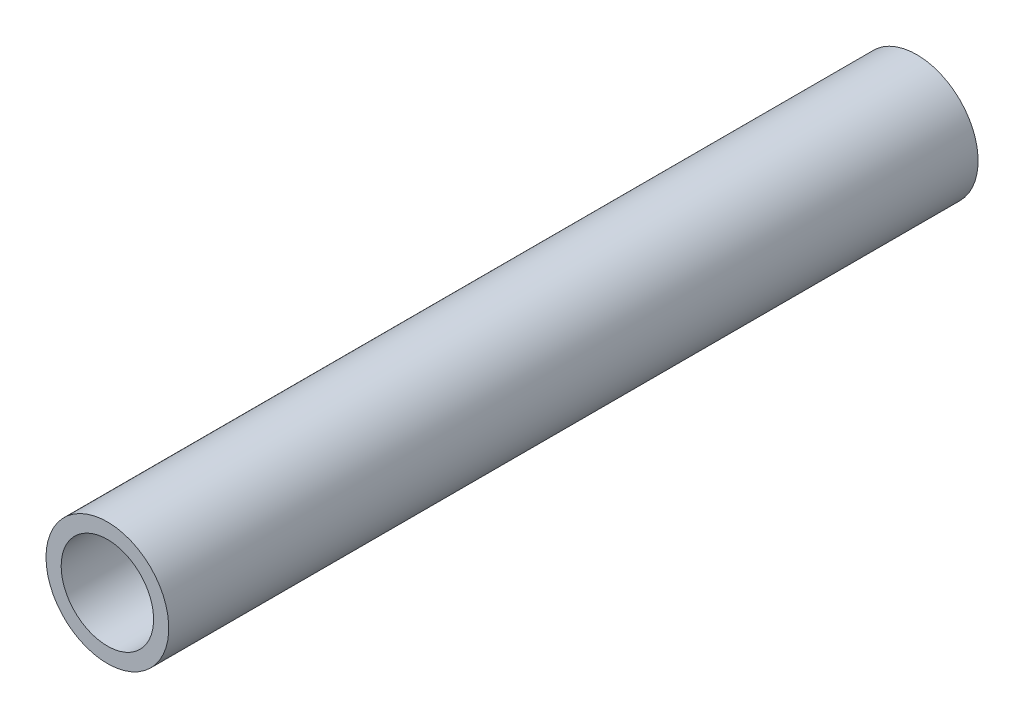
ISO-10303-21;
HEADER;
FILE_DESCRIPTION(('STEP AP214'),'2;1');
FILE_NAME('part.step','',(''),(''),'','','');
FILE_SCHEMA(('AUTOMOTIVE_DESIGN { 1 0 10303 214 1 1 1 1 }'));
ENDSEC;
DATA;
#1=APPLICATION_CONTEXT('core data for automotive mechanical design processes');
#2=APPLICATION_PROTOCOL_DEFINITION('international standard','automotive_design',2000,#1);
#3=PRODUCT_CONTEXT('',#1,'mechanical');
#4=PRODUCT('Part','Part','',(#3));
#5=PRODUCT_RELATED_PRODUCT_CATEGORY('part','',(#4));
#6=PRODUCT_DEFINITION_FORMATION('','',#4);
#7=PRODUCT_DEFINITION_CONTEXT('part definition',#1,'design');
#8=PRODUCT_DEFINITION('design','',#6,#7);
#9=PRODUCT_DEFINITION_SHAPE('','',#8);
#10=(LENGTH_UNIT() NAMED_UNIT(*) SI_UNIT(.MILLI.,.METRE.));
#11=(NAMED_UNIT(*) PLANE_ANGLE_UNIT() SI_UNIT($,.RADIAN.));
#12=(NAMED_UNIT(*) SI_UNIT($,.STERADIAN.) SOLID_ANGLE_UNIT());
#13=UNCERTAINTY_MEASURE_WITH_UNIT(LENGTH_MEASURE(1.E-05),#10,'distance_accuracy_value','');
#14=(GEOMETRIC_REPRESENTATION_CONTEXT(3) GLOBAL_UNCERTAINTY_ASSIGNED_CONTEXT((#13)) GLOBAL_UNIT_ASSIGNED_CONTEXT((#10,
#11,#12)) REPRESENTATION_CONTEXT('',''));
#15=CARTESIAN_POINT('',(0.,0.,0.));
#16=DIRECTION('',(0.,0.,1.));
#17=DIRECTION('',(1.,0.,0.));
#18=AXIS2_PLACEMENT_3D('',#15,#16,#17);
#19=CARTESIAN_POINT('',(0.,0.,13.35));
#20=DIRECTION('',(0.,0.,-1.));
#21=DIRECTION('',(-1.,0.,0.));
#22=AXIS2_PLACEMENT_3D('',#19,#20,#21);
#23=CYLINDRICAL_SURFACE('',#22,1.525);
#24=CARTESIAN_POINT('',(0.,0.,-13.35));
#25=DIRECTION('',(0.,0.,-1.));
#26=DIRECTION('',(-1.,0.,0.));
#27=AXIS2_PLACEMENT_3D('',#24,#25,#26);
#28=CIRCLE('',#27,1.525);
#29=CARTESIAN_POINT('',(-1.525,0.,-13.35));
#30=VERTEX_POINT('',#29);
#31=EDGE_CURVE('E28',#30,#30,#28,.T.);
#32=ORIENTED_EDGE('',*,*,#31,.T.);
#33=EDGE_LOOP('',(#32));
#34=FACE_BOUND('',#33,.T.);
#35=CARTESIAN_POINT('',(0.,0.,13.35));
#36=DIRECTION('',(0.,0.,-1.));
#37=DIRECTION('',(-1.,0.,0.));
#38=AXIS2_PLACEMENT_3D('',#35,#36,#37);
#39=CIRCLE('',#38,1.525);
#40=CARTESIAN_POINT('',(-1.525,0.,13.35));
#41=VERTEX_POINT('',#40);
#42=EDGE_CURVE('E19',#41,#41,#39,.T.);
#43=ORIENTED_EDGE('',*,*,#42,.F.);
#44=EDGE_LOOP('',(#43));
#45=FACE_BOUND('',#44,.T.);
#46=ADVANCED_FACE('F16',(#34,#45),#23,.F.);
#47=CARTESIAN_POINT('',(0.,0.,13.35));
#48=DIRECTION('',(0.,0.,1.));
#49=DIRECTION('',(1.,0.,0.));
#50=AXIS2_PLACEMENT_3D('',#47,#48,#49);
#51=PLANE('',#50);
#52=ORIENTED_EDGE('',*,*,#42,.T.);
#53=EDGE_LOOP('',(#52));
#54=FACE_BOUND('',#53,.T.);
#55=CARTESIAN_POINT('',(0.,0.,13.35));
#56=DIRECTION('',(0.,0.,-1.));
#57=DIRECTION('',(-1.,0.,0.));
#58=AXIS2_PLACEMENT_3D('',#55,#56,#57);
#59=CIRCLE('',#58,2.025);
#60=CARTESIAN_POINT('',(-2.025,0.,13.35));
#61=VERTEX_POINT('',#60);
#62=EDGE_CURVE('E23',#61,#61,#59,.T.);
#63=ORIENTED_EDGE('',*,*,#62,.F.);
#64=EDGE_LOOP('',(#63));
#65=FACE_BOUND('',#64,.T.);
#66=ADVANCED_FACE('F36',(#54,#65),#51,.T.);
#67=CARTESIAN_POINT('',(0.,0.,-13.35));
#68=DIRECTION('',(0.,0.,1.));
#69=DIRECTION('',(1.,0.,0.));
#70=AXIS2_PLACEMENT_3D('',#67,#68,#69);
#71=PLANE('',#70);
#72=ORIENTED_EDGE('',*,*,#31,.F.);
#73=EDGE_LOOP('',(#72));
#74=FACE_BOUND('',#73,.T.);
#75=CARTESIAN_POINT('',(0.,0.,-13.35));
#76=DIRECTION('',(0.,0.,-1.));
#77=DIRECTION('',(-1.,0.,0.));
#78=AXIS2_PLACEMENT_3D('',#75,#76,#77);
#79=CIRCLE('',#78,2.025);
#80=CARTESIAN_POINT('',(-2.025,0.,-13.35));
#81=VERTEX_POINT('',#80);
#82=EDGE_CURVE('E10',#81,#81,#79,.F.);
#83=ORIENTED_EDGE('',*,*,#82,.F.);
#84=EDGE_LOOP('',(#83));
#85=FACE_BOUND('',#84,.T.);
#86=ADVANCED_FACE('F43',(#74,#85),#71,.F.);
#87=CARTESIAN_POINT('',(0.,0.,13.35));
#88=DIRECTION('',(0.,0.,-1.));
#89=DIRECTION('',(-1.,0.,0.));
#90=AXIS2_PLACEMENT_3D('',#87,#88,#89);
#91=CYLINDRICAL_SURFACE('',#90,2.025);
#92=ORIENTED_EDGE('',*,*,#82,.T.);
#93=EDGE_LOOP('',(#92));
#94=FACE_BOUND('',#93,.T.);
#95=ORIENTED_EDGE('',*,*,#62,.T.);
#96=EDGE_LOOP('',(#95));
#97=FACE_BOUND('',#96,.T.);
#98=ADVANCED_FACE('F44',(#94,#97),#91,.T.);
#99=CLOSED_SHELL('',(#46,#66,#86,#98));
#100=MANIFOLD_SOLID_BREP('B1',#99);
#101=ADVANCED_BREP_SHAPE_REPRESENTATION('',(#18,#100),#14);
#102=SHAPE_DEFINITION_REPRESENTATION(#9,#101);
ENDSEC;
END-ISO-10303-21;
